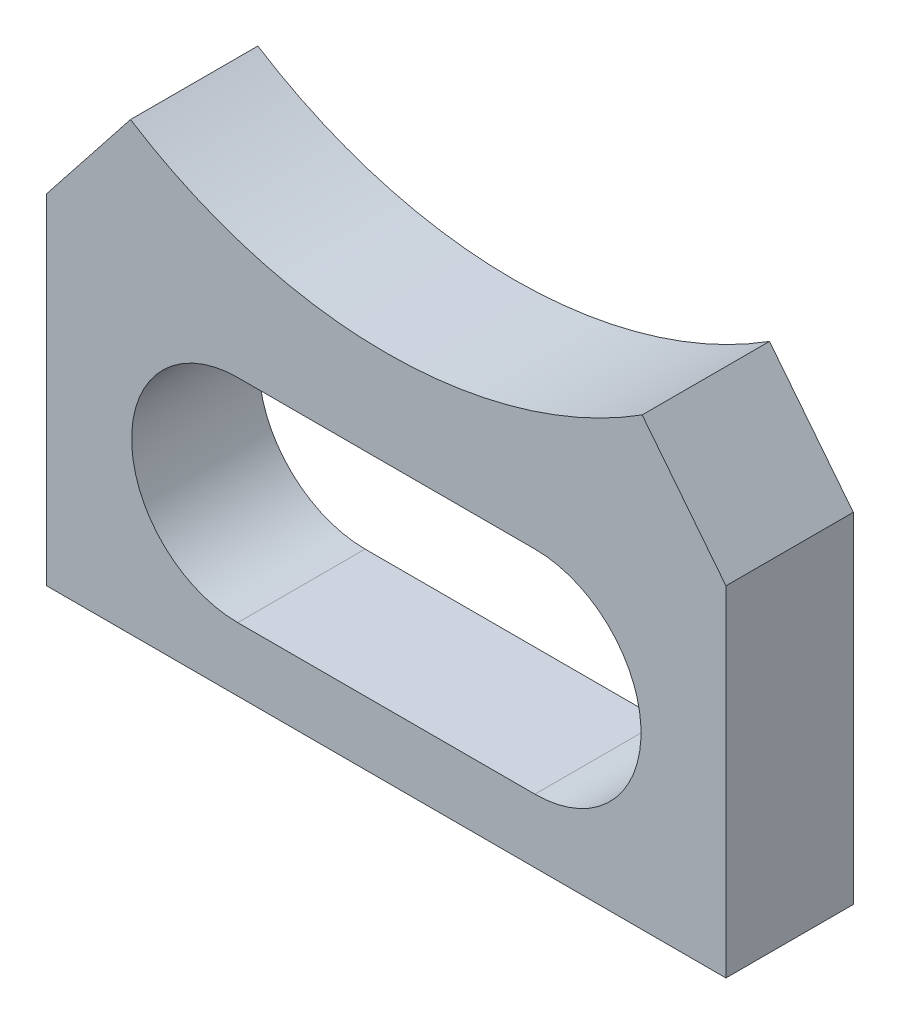
ISO-10303-21;
HEADER;
FILE_DESCRIPTION(('STEP AP214'),'2;1');
FILE_NAME('part.step','',(''),(''),'','','');
FILE_SCHEMA(('AUTOMOTIVE_DESIGN { 1 0 10303 214 1 1 1 1 }'));
ENDSEC;
DATA;
#1=APPLICATION_CONTEXT('core data for automotive mechanical design processes');
#2=APPLICATION_PROTOCOL_DEFINITION('international standard','automotive_design',2000,#1);
#3=PRODUCT_CONTEXT('',#1,'mechanical');
#4=PRODUCT('Part','Part','',(#3));
#5=PRODUCT_RELATED_PRODUCT_CATEGORY('part','',(#4));
#6=PRODUCT_DEFINITION_FORMATION('','',#4);
#7=PRODUCT_DEFINITION_CONTEXT('part definition',#1,'design');
#8=PRODUCT_DEFINITION('design','',#6,#7);
#9=PRODUCT_DEFINITION_SHAPE('','',#8);
#10=(LENGTH_UNIT() NAMED_UNIT(*) SI_UNIT(.MILLI.,.METRE.));
#11=(NAMED_UNIT(*) PLANE_ANGLE_UNIT() SI_UNIT($,.RADIAN.));
#12=(NAMED_UNIT(*) SI_UNIT($,.STERADIAN.) SOLID_ANGLE_UNIT());
#13=UNCERTAINTY_MEASURE_WITH_UNIT(LENGTH_MEASURE(1.E-05),#10,'distance_accuracy_value','');
#14=(GEOMETRIC_REPRESENTATION_CONTEXT(3) GLOBAL_UNCERTAINTY_ASSIGNED_CONTEXT((#13)) GLOBAL_UNIT_ASSIGNED_CONTEXT((#10,
#11,#12)) REPRESENTATION_CONTEXT('',''));
#15=CARTESIAN_POINT('',(0.,0.,0.));
#16=DIRECTION('',(0.,0.,1.));
#17=DIRECTION('',(1.,0.,0.));
#18=AXIS2_PLACEMENT_3D('',#15,#16,#17);
#19=CARTESIAN_POINT('',(-16.,0.,-6.));
#20=DIRECTION('',(-1.,0.,0.));
#21=DIRECTION('',(0.,0.,1.));
#22=AXIS2_PLACEMENT_3D('',#19,#20,#21);
#23=PLANE('',#22);
#24=DIRECTION('',(0.,-1.,0.));
#25=VECTOR('',#24,1.);
#26=CARTESIAN_POINT('',(-16.,0.,0.));
#27=LINE('',#26,#25);
#28=CARTESIAN_POINT('',(-16.,16.,0.));
#29=VERTEX_POINT('',#28);
#30=CARTESIAN_POINT('',(-16.,0.,0.));
#31=VERTEX_POINT('',#30);
#32=EDGE_CURVE('E148',#29,#31,#27,.T.);
#33=ORIENTED_EDGE('',*,*,#32,.F.);
#34=DIRECTION('',(0.,0.,1.));
#35=VECTOR('',#34,1.);
#36=CARTESIAN_POINT('',(-16.,16.,-6.));
#37=LINE('',#36,#35);
#38=CARTESIAN_POINT('',(-16.,16.,-6.));
#39=VERTEX_POINT('',#38);
#40=EDGE_CURVE('E11',#39,#29,#37,.T.);
#41=ORIENTED_EDGE('',*,*,#40,.F.);
#42=DIRECTION('',(0.,-1.,0.));
#43=VECTOR('',#42,1.);
#44=CARTESIAN_POINT('',(-16.,0.,-6.));
#45=LINE('',#44,#43);
#46=CARTESIAN_POINT('',(-16.,0.,-6.));
#47=VERTEX_POINT('',#46);
#48=EDGE_CURVE('E152',#39,#47,#45,.T.);
#49=ORIENTED_EDGE('',*,*,#48,.T.);
#50=DIRECTION('',(0.,0.,1.));
#51=VECTOR('',#50,1.);
#52=CARTESIAN_POINT('',(-16.,0.,-6.));
#53=LINE('',#52,#51);
#54=EDGE_CURVE('E41',#47,#31,#53,.T.);
#55=ORIENTED_EDGE('',*,*,#54,.T.);
#56=EDGE_LOOP('',(#33,#41,#49,#55));
#57=FACE_BOUND('',#56,.T.);
#58=ADVANCED_FACE('F38',(#57),#23,.T.);
#59=CARTESIAN_POINT('',(-16.,16.,-6.));
#60=DIRECTION('',(-0.784832318320194,0.619708183034685,0.));
#61=DIRECTION('',(-0.619708183034685,-0.784832318320194,0.));
#62=AXIS2_PLACEMENT_3D('',#59,#60,#61);
#63=PLANE('',#62);
#64=DIRECTION('',(-0.619708183034685,-0.784832318320194,0.));
#65=VECTOR('',#64,1.);
#66=CARTESIAN_POINT('',(-16.,16.,0.));
#67=LINE('',#66,#65);
#68=CARTESIAN_POINT('',(-12.051970793194,21.,0.));
#69=VERTEX_POINT('',#68);
#70=EDGE_CURVE('E156',#69,#29,#67,.T.);
#71=ORIENTED_EDGE('',*,*,#70,.F.);
#72=DIRECTION('',(0.,0.,1.));
#73=VECTOR('',#72,1.);
#74=CARTESIAN_POINT('',(-12.051970793194,21.,-6.));
#75=LINE('',#74,#73);
#76=CARTESIAN_POINT('',(-12.051970793194,21.,-6.));
#77=VERTEX_POINT('',#76);
#78=EDGE_CURVE('E46',#77,#69,#75,.T.);
#79=ORIENTED_EDGE('',*,*,#78,.F.);
#80=DIRECTION('',(-0.619708183034685,-0.784832318320194,0.));
#81=VECTOR('',#80,1.);
#82=CARTESIAN_POINT('',(-16.,16.,-6.));
#83=LINE('',#82,#81);
#84=EDGE_CURVE('E168',#77,#39,#83,.T.);
#85=ORIENTED_EDGE('',*,*,#84,.T.);
#86=ORIENTED_EDGE('',*,*,#40,.T.);
#87=EDGE_LOOP('',(#71,#79,#85,#86));
#88=FACE_BOUND('',#87,.T.);
#89=ADVANCED_FACE('F205',(#88),#63,.T.);
#90=CARTESIAN_POINT('',(0.,40.,-6.));
#91=DIRECTION('',(0.,0.,1.));
#92=DIRECTION('',(1.,0.,0.));
#93=AXIS2_PLACEMENT_3D('',#90,#91,#92);
#94=CYLINDRICAL_SURFACE('',#93,22.5);
#95=CARTESIAN_POINT('',(0.,40.,0.));
#96=DIRECTION('',(0.,0.,-1.));
#97=DIRECTION('',(1.,0.,0.));
#98=AXIS2_PLACEMENT_3D('',#95,#96,#97);
#99=CIRCLE('',#98,22.5);
#100=CARTESIAN_POINT('',(12.051970793194,21.,0.));
#101=VERTEX_POINT('',#100);
#102=EDGE_CURVE('E182',#101,#69,#99,.T.);
#103=ORIENTED_EDGE('',*,*,#102,.F.);
#104=DIRECTION('',(0.,0.,1.));
#105=VECTOR('',#104,1.);
#106=CARTESIAN_POINT('',(12.051970793194,21.,-6.));
#107=LINE('',#106,#105);
#108=CARTESIAN_POINT('',(12.051970793194,21.,-6.));
#109=VERTEX_POINT('',#108);
#110=EDGE_CURVE('E188',#109,#101,#107,.T.);
#111=ORIENTED_EDGE('',*,*,#110,.F.);
#112=CARTESIAN_POINT('',(0.,40.,-6.));
#113=DIRECTION('',(0.,0.,-1.));
#114=DIRECTION('',(1.,0.,0.));
#115=AXIS2_PLACEMENT_3D('',#112,#113,#114);
#116=CIRCLE('',#115,22.5);
#117=EDGE_CURVE('E165',#109,#77,#116,.T.);
#118=ORIENTED_EDGE('',*,*,#117,.T.);
#119=ORIENTED_EDGE('',*,*,#78,.T.);
#120=EDGE_LOOP('',(#103,#111,#118,#119));
#121=FACE_BOUND('',#120,.T.);
#122=ADVANCED_FACE('F216',(#121),#94,.F.);
#123=CARTESIAN_POINT('',(16.,16.,-6.));
#124=DIRECTION('',(0.784832318320194,0.619708183034685,0.));
#125=DIRECTION('',(-0.619708183034685,0.784832318320194,0.));
#126=AXIS2_PLACEMENT_3D('',#123,#124,#125);
#127=PLANE('',#126);
#128=DIRECTION('',(-0.619708183034685,0.784832318320194,0.));
#129=VECTOR('',#128,1.);
#130=CARTESIAN_POINT('',(16.,16.,0.));
#131=LINE('',#130,#129);
#132=CARTESIAN_POINT('',(16.,16.,0.));
#133=VERTEX_POINT('',#132);
#134=EDGE_CURVE('E179',#133,#101,#131,.T.);
#135=ORIENTED_EDGE('',*,*,#134,.F.);
#136=DIRECTION('',(0.,0.,1.));
#137=VECTOR('',#136,1.);
#138=CARTESIAN_POINT('',(16.,16.,-6.));
#139=LINE('',#138,#137);
#140=CARTESIAN_POINT('',(16.,16.,-6.));
#141=VERTEX_POINT('',#140);
#142=EDGE_CURVE('E190',#141,#133,#139,.T.);
#143=ORIENTED_EDGE('',*,*,#142,.F.);
#144=DIRECTION('',(-0.619708183034685,0.784832318320194,0.));
#145=VECTOR('',#144,1.);
#146=CARTESIAN_POINT('',(16.,16.,-6.));
#147=LINE('',#146,#145);
#148=EDGE_CURVE('E162',#141,#109,#147,.T.);
#149=ORIENTED_EDGE('',*,*,#148,.T.);
#150=ORIENTED_EDGE('',*,*,#110,.T.);
#151=EDGE_LOOP('',(#135,#143,#149,#150));
#152=FACE_BOUND('',#151,.T.);
#153=ADVANCED_FACE('F214',(#152),#127,.T.);
#154=CARTESIAN_POINT('',(16.,16.,-6.));
#155=DIRECTION('',(1.,0.,0.));
#156=DIRECTION('',(0.,0.,-1.));
#157=AXIS2_PLACEMENT_3D('',#154,#155,#156);
#158=PLANE('',#157);
#159=DIRECTION('',(0.,1.,0.));
#160=VECTOR('',#159,1.);
#161=CARTESIAN_POINT('',(16.,16.,0.));
#162=LINE('',#161,#160);
#163=CARTESIAN_POINT('',(16.,0.,0.));
#164=VERTEX_POINT('',#163);
#165=EDGE_CURVE('E176',#164,#133,#162,.T.);
#166=ORIENTED_EDGE('',*,*,#165,.F.);
#167=DIRECTION('',(0.,0.,1.));
#168=VECTOR('',#167,1.);
#169=CARTESIAN_POINT('',(16.,0.,-6.));
#170=LINE('',#169,#168);
#171=CARTESIAN_POINT('',(16.,0.,-6.));
#172=VERTEX_POINT('',#171);
#173=EDGE_CURVE('E191',#172,#164,#170,.T.);
#174=ORIENTED_EDGE('',*,*,#173,.F.);
#175=DIRECTION('',(0.,1.,0.));
#176=VECTOR('',#175,1.);
#177=CARTESIAN_POINT('',(16.,16.,-6.));
#178=LINE('',#177,#176);
#179=EDGE_CURVE('E159',#172,#141,#178,.T.);
#180=ORIENTED_EDGE('',*,*,#179,.T.);
#181=ORIENTED_EDGE('',*,*,#142,.T.);
#182=EDGE_LOOP('',(#166,#174,#180,#181));
#183=FACE_BOUND('',#182,.T.);
#184=ADVANCED_FACE('F211',(#183),#158,.T.);
#185=CARTESIAN_POINT('',(-16.,0.,-6.));
#186=DIRECTION('',(0.,-1.,0.));
#187=DIRECTION('',(1.,0.,0.));
#188=AXIS2_PLACEMENT_3D('',#185,#186,#187);
#189=PLANE('',#188);
#190=DIRECTION('',(1.,0.,0.));
#191=VECTOR('',#190,1.);
#192=CARTESIAN_POINT('',(-16.,0.,0.));
#193=LINE('',#192,#191);
#194=EDGE_CURVE('E173',#31,#164,#193,.T.);
#195=ORIENTED_EDGE('',*,*,#194,.F.);
#196=ORIENTED_EDGE('',*,*,#54,.F.);
#197=DIRECTION('',(1.,0.,0.));
#198=VECTOR('',#197,1.);
#199=CARTESIAN_POINT('',(-16.,0.,-6.));
#200=LINE('',#199,#198);
#201=EDGE_CURVE('E155',#47,#172,#200,.T.);
#202=ORIENTED_EDGE('',*,*,#201,.T.);
#203=ORIENTED_EDGE('',*,*,#173,.T.);
#204=EDGE_LOOP('',(#195,#196,#202,#203));
#205=FACE_BOUND('',#204,.T.);
#206=ADVANCED_FACE('F199',(#205),#189,.T.);
#207=CARTESIAN_POINT('',(0.,40.,-6.));
#208=DIRECTION('',(0.,0.,1.));
#209=DIRECTION('',(1.,0.,0.));
#210=AXIS2_PLACEMENT_3D('',#207,#208,#209);
#211=PLANE('',#210);
#212=DIRECTION('',(-1.,0.,0.));
#213=VECTOR('',#212,1.);
#214=CARTESIAN_POINT('',(-6.99999999999999,13.,-6.));
#215=LINE('',#214,#213);
#216=CARTESIAN_POINT('',(7.00000000000001,13.,-6.));
#217=VERTEX_POINT('',#216);
#218=CARTESIAN_POINT('',(-6.99999999999999,13.,-6.));
#219=VERTEX_POINT('',#218);
#220=EDGE_CURVE('E123',#217,#219,#215,.T.);
#221=ORIENTED_EDGE('',*,*,#220,.T.);
#222=CARTESIAN_POINT('',(-6.99999999999999,8.,-6.));
#223=DIRECTION('',(0.,0.,1.));
#224=DIRECTION('',(1.,0.,0.));
#225=AXIS2_PLACEMENT_3D('',#222,#223,#224);
#226=CIRCLE('',#225,5.);
#227=CARTESIAN_POINT('',(-6.99999999999999,3.,-6.));
#228=VERTEX_POINT('',#227);
#229=EDGE_CURVE('E117',#219,#228,#226,.T.);
#230=ORIENTED_EDGE('',*,*,#229,.T.);
#231=DIRECTION('',(1.,0.,0.));
#232=VECTOR('',#231,1.);
#233=CARTESIAN_POINT('',(-6.99999999999999,3.,-6.));
#234=LINE('',#233,#232);
#235=CARTESIAN_POINT('',(7.00000000000001,3.,-6.));
#236=VERTEX_POINT('',#235);
#237=EDGE_CURVE('E126',#228,#236,#234,.T.);
#238=ORIENTED_EDGE('',*,*,#237,.T.);
#239=CARTESIAN_POINT('',(7.00000000000001,8.,-6.));
#240=DIRECTION('',(0.,0.,1.));
#241=DIRECTION('',(1.,0.,0.));
#242=AXIS2_PLACEMENT_3D('',#239,#240,#241);
#243=CIRCLE('',#242,5.);
#244=EDGE_CURVE('E54',#236,#217,#243,.T.);
#245=ORIENTED_EDGE('',*,*,#244,.T.);
#246=EDGE_LOOP('',(#221,#230,#238,#245));
#247=FACE_BOUND('',#246,.T.);
#248=ORIENTED_EDGE('',*,*,#48,.F.);
#249=ORIENTED_EDGE('',*,*,#84,.F.);
#250=ORIENTED_EDGE('',*,*,#117,.F.);
#251=ORIENTED_EDGE('',*,*,#148,.F.);
#252=ORIENTED_EDGE('',*,*,#179,.F.);
#253=ORIENTED_EDGE('',*,*,#201,.F.);
#254=EDGE_LOOP('',(#248,#249,#250,#251,#252,#253));
#255=FACE_BOUND('',#254,.T.);
#256=ADVANCED_FACE('F130',(#247,#255),#211,.F.);
#257=CARTESIAN_POINT('',(0.,40.,0.));
#258=DIRECTION('',(0.,0.,1.));
#259=DIRECTION('',(1.,0.,0.));
#260=AXIS2_PLACEMENT_3D('',#257,#258,#259);
#261=PLANE('',#260);
#262=CARTESIAN_POINT('',(-6.99999999999999,8.,0.));
#263=DIRECTION('',(0.,0.,1.));
#264=DIRECTION('',(1.,0.,0.));
#265=AXIS2_PLACEMENT_3D('',#262,#263,#264);
#266=CIRCLE('',#265,5.);
#267=CARTESIAN_POINT('',(-6.99999999999999,13.,0.));
#268=VERTEX_POINT('',#267);
#269=CARTESIAN_POINT('',(-6.99999999999999,3.,0.));
#270=VERTEX_POINT('',#269);
#271=EDGE_CURVE('E62',#268,#270,#266,.T.);
#272=ORIENTED_EDGE('',*,*,#271,.F.);
#273=DIRECTION('',(-1.,0.,0.));
#274=VECTOR('',#273,1.);
#275=CARTESIAN_POINT('',(-6.99999999999999,13.,0.));
#276=LINE('',#275,#274);
#277=CARTESIAN_POINT('',(7.00000000000001,13.,0.));
#278=VERTEX_POINT('',#277);
#279=EDGE_CURVE('E133',#278,#268,#276,.T.);
#280=ORIENTED_EDGE('',*,*,#279,.F.);
#281=CARTESIAN_POINT('',(7.00000000000001,8.,0.));
#282=DIRECTION('',(0.,0.,1.));
#283=DIRECTION('',(1.,0.,0.));
#284=AXIS2_PLACEMENT_3D('',#281,#282,#283);
#285=CIRCLE('',#284,5.);
#286=CARTESIAN_POINT('',(7.00000000000001,3.,0.));
#287=VERTEX_POINT('',#286);
#288=EDGE_CURVE('E136',#287,#278,#285,.T.);
#289=ORIENTED_EDGE('',*,*,#288,.F.);
#290=DIRECTION('',(1.,0.,0.));
#291=VECTOR('',#290,1.);
#292=CARTESIAN_POINT('',(-6.99999999999999,3.,0.));
#293=LINE('',#292,#291);
#294=EDGE_CURVE('E142',#270,#287,#293,.T.);
#295=ORIENTED_EDGE('',*,*,#294,.F.);
#296=EDGE_LOOP('',(#272,#280,#289,#295));
#297=FACE_BOUND('',#296,.T.);
#298=ORIENTED_EDGE('',*,*,#32,.T.);
#299=ORIENTED_EDGE('',*,*,#194,.T.);
#300=ORIENTED_EDGE('',*,*,#165,.T.);
#301=ORIENTED_EDGE('',*,*,#134,.T.);
#302=ORIENTED_EDGE('',*,*,#102,.T.);
#303=ORIENTED_EDGE('',*,*,#70,.T.);
#304=EDGE_LOOP('',(#298,#299,#300,#301,#302,#303));
#305=FACE_BOUND('',#304,.T.);
#306=ADVANCED_FACE('F201',(#297,#305),#261,.T.);
#307=CARTESIAN_POINT('',(-6.99999999999999,8.,-6.));
#308=DIRECTION('',(0.,0.,1.));
#309=DIRECTION('',(1.,0.,0.));
#310=AXIS2_PLACEMENT_3D('',#307,#308,#309);
#311=CYLINDRICAL_SURFACE('',#310,5.);
#312=ORIENTED_EDGE('',*,*,#271,.T.);
#313=DIRECTION('',(0.,0.,1.));
#314=VECTOR('',#313,1.);
#315=CARTESIAN_POINT('',(-6.99999999999999,3.,-6.));
#316=LINE('',#315,#314);
#317=EDGE_CURVE('E113',#228,#270,#316,.T.);
#318=ORIENTED_EDGE('',*,*,#317,.F.);
#319=ORIENTED_EDGE('',*,*,#229,.F.);
#320=DIRECTION('',(0.,0.,1.));
#321=VECTOR('',#320,1.);
#322=CARTESIAN_POINT('',(-6.99999999999999,13.,-6.));
#323=LINE('',#322,#321);
#324=EDGE_CURVE('E146',#219,#268,#323,.T.);
#325=ORIENTED_EDGE('',*,*,#324,.T.);
#326=EDGE_LOOP('',(#312,#318,#319,#325));
#327=FACE_BOUND('',#326,.T.);
#328=ADVANCED_FACE('F115',(#327),#311,.F.);
#329=CARTESIAN_POINT('',(-6.99999999999999,13.,-6.));
#330=DIRECTION('',(0.,1.,0.));
#331=DIRECTION('',(0.,0.,1.));
#332=AXIS2_PLACEMENT_3D('',#329,#330,#331);
#333=PLANE('',#332);
#334=ORIENTED_EDGE('',*,*,#279,.T.);
#335=ORIENTED_EDGE('',*,*,#324,.F.);
#336=ORIENTED_EDGE('',*,*,#220,.F.);
#337=DIRECTION('',(0.,0.,1.));
#338=VECTOR('',#337,1.);
#339=CARTESIAN_POINT('',(7.00000000000001,13.,-6.));
#340=LINE('',#339,#338);
#341=EDGE_CURVE('E149',#217,#278,#340,.T.);
#342=ORIENTED_EDGE('',*,*,#341,.T.);
#343=EDGE_LOOP('',(#334,#335,#336,#342));
#344=FACE_BOUND('',#343,.T.);
#345=ADVANCED_FACE('F284',(#344),#333,.F.);
#346=CARTESIAN_POINT('',(7.00000000000001,8.,-6.));
#347=DIRECTION('',(0.,0.,1.));
#348=DIRECTION('',(1.,0.,0.));
#349=AXIS2_PLACEMENT_3D('',#346,#347,#348);
#350=CYLINDRICAL_SURFACE('',#349,5.);
#351=ORIENTED_EDGE('',*,*,#288,.T.);
#352=ORIENTED_EDGE('',*,*,#341,.F.);
#353=ORIENTED_EDGE('',*,*,#244,.F.);
#354=DIRECTION('',(0.,0.,1.));
#355=VECTOR('',#354,1.);
#356=CARTESIAN_POINT('',(7.00000000000001,3.,-6.));
#357=LINE('',#356,#355);
#358=EDGE_CURVE('E122',#236,#287,#357,.T.);
#359=ORIENTED_EDGE('',*,*,#358,.T.);
#360=EDGE_LOOP('',(#351,#352,#353,#359));
#361=FACE_BOUND('',#360,.T.);
#362=ADVANCED_FACE('F293',(#361),#350,.F.);
#363=CARTESIAN_POINT('',(-6.99999999999999,3.,-6.));
#364=DIRECTION('',(0.,-1.,0.));
#365=DIRECTION('',(0.,0.,-1.));
#366=AXIS2_PLACEMENT_3D('',#363,#364,#365);
#367=PLANE('',#366);
#368=ORIENTED_EDGE('',*,*,#294,.T.);
#369=ORIENTED_EDGE('',*,*,#358,.F.);
#370=ORIENTED_EDGE('',*,*,#237,.F.);
#371=ORIENTED_EDGE('',*,*,#317,.T.);
#372=EDGE_LOOP('',(#368,#369,#370,#371));
#373=FACE_BOUND('',#372,.T.);
#374=ADVANCED_FACE('F127',(#373),#367,.F.);
#375=CLOSED_SHELL('',(#58,#89,#122,#153,#184,#206,#256,#306,#328,#345,#362,#374));
#376=MANIFOLD_SOLID_BREP('B2',#375);
#377=ADVANCED_BREP_SHAPE_REPRESENTATION('',(#18,#376),#14);
#378=SHAPE_DEFINITION_REPRESENTATION(#9,#377);
ENDSEC;
END-ISO-10303-21;
